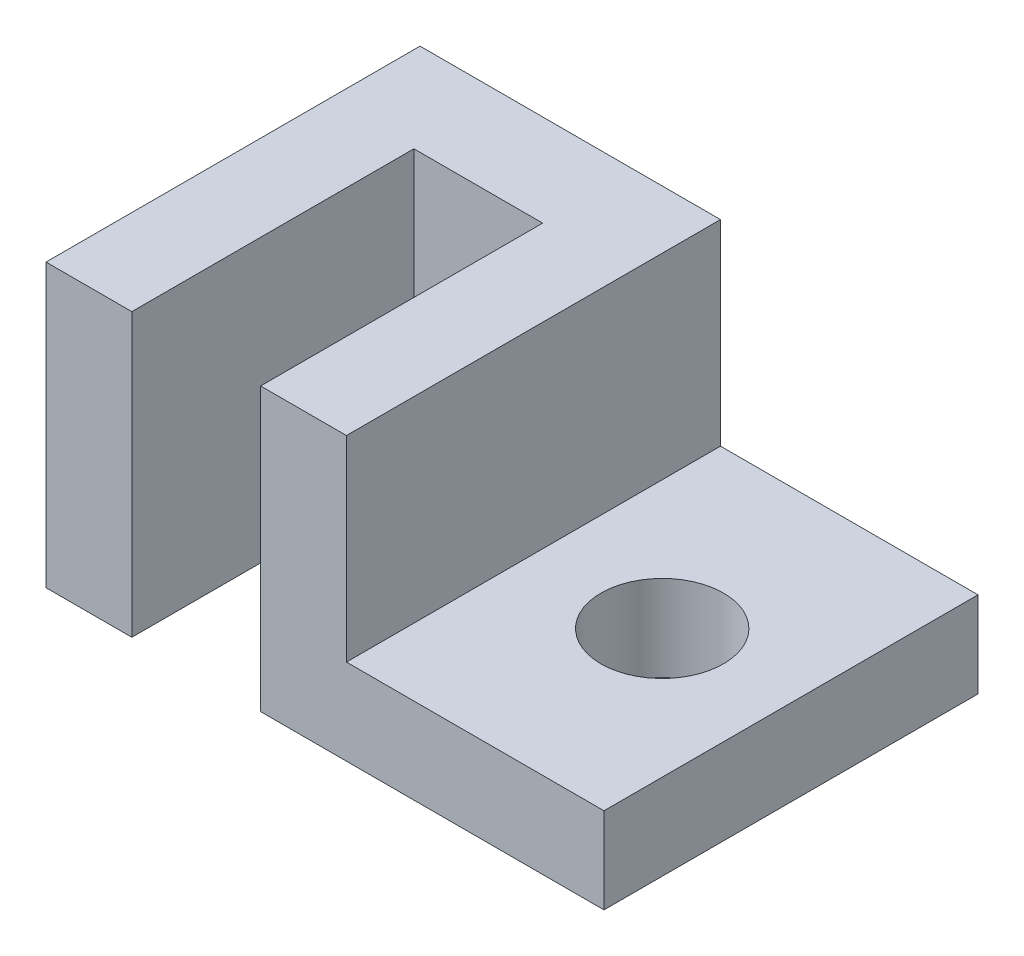
ISO-10303-21;
HEADER;
FILE_DESCRIPTION(('STEP AP214'),'2;1');
FILE_NAME('part.step','',(''),(''),'','','');
FILE_SCHEMA(('AUTOMOTIVE_DESIGN { 1 0 10303 214 1 1 1 1 }'));
ENDSEC;
DATA;
#1=APPLICATION_CONTEXT('core data for automotive mechanical design processes');
#2=APPLICATION_PROTOCOL_DEFINITION('international standard','automotive_design',2000,#1);
#3=PRODUCT_CONTEXT('',#1,'mechanical');
#4=PRODUCT('Part','Part','',(#3));
#5=PRODUCT_RELATED_PRODUCT_CATEGORY('part','',(#4));
#6=PRODUCT_DEFINITION_FORMATION('','',#4);
#7=PRODUCT_DEFINITION_CONTEXT('part definition',#1,'design');
#8=PRODUCT_DEFINITION('design','',#6,#7);
#9=PRODUCT_DEFINITION_SHAPE('','',#8);
#10=(LENGTH_UNIT() NAMED_UNIT(*) SI_UNIT(.MILLI.,.METRE.));
#11=(NAMED_UNIT(*) PLANE_ANGLE_UNIT() SI_UNIT($,.RADIAN.));
#12=(NAMED_UNIT(*) SI_UNIT($,.STERADIAN.) SOLID_ANGLE_UNIT());
#13=UNCERTAINTY_MEASURE_WITH_UNIT(LENGTH_MEASURE(1.E-05),#10,'distance_accuracy_value','');
#14=(GEOMETRIC_REPRESENTATION_CONTEXT(3) GLOBAL_UNCERTAINTY_ASSIGNED_CONTEXT((#13)) GLOBAL_UNIT_ASSIGNED_CONTEXT((#10,
#11,#12)) REPRESENTATION_CONTEXT('',''));
#15=CARTESIAN_POINT('',(0.,0.,0.));
#16=DIRECTION('',(0.,0.,1.));
#17=DIRECTION('',(1.,0.,0.));
#18=AXIS2_PLACEMENT_3D('',#15,#16,#17);
#19=CARTESIAN_POINT('',(49.,46.,-61.));
#20=DIRECTION('',(-1.,0.,0.));
#21=DIRECTION('',(0.,0.,1.));
#22=AXIS2_PLACEMENT_3D('',#19,#20,#21);
#23=PLANE('',#22);
#24=DIRECTION('',(0.,0.,1.));
#25=VECTOR('',#24,1.);
#26=CARTESIAN_POINT('',(49.,14.,-61.));
#27=LINE('',#26,#25);
#28=CARTESIAN_POINT('',(49.,14.,-61.));
#29=VERTEX_POINT('',#28);
#30=CARTESIAN_POINT('',(49.,14.,0.));
#31=VERTEX_POINT('',#30);
#32=EDGE_CURVE('E48',#29,#31,#27,.T.);
#33=ORIENTED_EDGE('',*,*,#32,.F.);
#34=DIRECTION('',(0.,-1.,0.));
#35=VECTOR('',#34,1.);
#36=CARTESIAN_POINT('',(49.,46.,-61.));
#37=LINE('',#36,#35);
#38=CARTESIAN_POINT('',(49.,46.,-61.));
#39=VERTEX_POINT('',#38);
#40=EDGE_CURVE('E117',#39,#29,#37,.T.);
#41=ORIENTED_EDGE('',*,*,#40,.F.);
#42=DIRECTION('',(0.,0.,-1.));
#43=VECTOR('',#42,1.);
#44=CARTESIAN_POINT('',(49.,46.,-61.));
#45=LINE('',#44,#43);
#46=CARTESIAN_POINT('',(49.,46.,0.));
#47=VERTEX_POINT('',#46);
#48=EDGE_CURVE('E108',#47,#39,#45,.T.);
#49=ORIENTED_EDGE('',*,*,#48,.F.);
#50=DIRECTION('',(0.,-1.,0.));
#51=VECTOR('',#50,1.);
#52=CARTESIAN_POINT('',(49.,46.,0.));
#53=LINE('',#52,#51);
#54=EDGE_CURVE('E121',#47,#31,#53,.T.);
#55=ORIENTED_EDGE('',*,*,#54,.T.);
#56=EDGE_LOOP('',(#33,#41,#49,#55));
#57=FACE_BOUND('',#56,.T.);
#58=ADVANCED_FACE('F33',(#57),#23,.F.);
#59=CARTESIAN_POINT('',(14.,46.,0.));
#60=DIRECTION('',(0.,0.,-1.));
#61=DIRECTION('',(-1.,0.,0.));
#62=AXIS2_PLACEMENT_3D('',#59,#60,#61);
#63=PLANE('',#62);
#64=DIRECTION('',(1.,0.,0.));
#65=VECTOR('',#64,1.);
#66=CARTESIAN_POINT('',(14.,0.,0.));
#67=LINE('',#66,#65);
#68=CARTESIAN_POINT('',(0.,0.,0.));
#69=VERTEX_POINT('',#68);
#70=CARTESIAN_POINT('',(14.,0.,0.));
#71=VERTEX_POINT('',#70);
#72=EDGE_CURVE('E130',#69,#71,#67,.T.);
#73=ORIENTED_EDGE('',*,*,#72,.T.);
#74=DIRECTION('',(0.,-1.,0.));
#75=VECTOR('',#74,1.);
#76=CARTESIAN_POINT('',(14.,46.,0.));
#77=LINE('',#76,#75);
#78=CARTESIAN_POINT('',(14.,46.,0.));
#79=VERTEX_POINT('',#78);
#80=EDGE_CURVE('E11',#79,#71,#77,.T.);
#81=ORIENTED_EDGE('',*,*,#80,.F.);
#82=DIRECTION('',(1.,0.,0.));
#83=VECTOR('',#82,1.);
#84=CARTESIAN_POINT('',(14.,46.,0.));
#85=LINE('',#84,#83);
#86=CARTESIAN_POINT('',(0.,46.,0.));
#87=VERTEX_POINT('',#86);
#88=EDGE_CURVE('E146',#87,#79,#85,.T.);
#89=ORIENTED_EDGE('',*,*,#88,.F.);
#90=DIRECTION('',(0.,-1.,0.));
#91=VECTOR('',#90,1.);
#92=CARTESIAN_POINT('',(0.,46.,0.));
#93=LINE('',#92,#91);
#94=EDGE_CURVE('E126',#87,#69,#93,.T.);
#95=ORIENTED_EDGE('',*,*,#94,.T.);
#96=EDGE_LOOP('',(#73,#81,#89,#95));
#97=FACE_BOUND('',#96,.T.);
#98=ADVANCED_FACE('F35',(#97),#63,.F.);
#99=CARTESIAN_POINT('',(14.,46.,-46.));
#100=DIRECTION('',(-1.,0.,0.));
#101=DIRECTION('',(0.,0.,1.));
#102=AXIS2_PLACEMENT_3D('',#99,#100,#101);
#103=PLANE('',#102);
#104=DIRECTION('',(0.,0.,-1.));
#105=VECTOR('',#104,1.);
#106=CARTESIAN_POINT('',(14.,0.,-46.));
#107=LINE('',#106,#105);
#108=CARTESIAN_POINT('',(14.,0.,-46.));
#109=VERTEX_POINT('',#108);
#110=EDGE_CURVE('E133',#71,#109,#107,.T.);
#111=ORIENTED_EDGE('',*,*,#110,.T.);
#112=DIRECTION('',(0.,-1.,0.));
#113=VECTOR('',#112,1.);
#114=CARTESIAN_POINT('',(14.,46.,-46.));
#115=LINE('',#114,#113);
#116=CARTESIAN_POINT('',(14.,46.,-46.));
#117=VERTEX_POINT('',#116);
#118=EDGE_CURVE('E41',#117,#109,#115,.T.);
#119=ORIENTED_EDGE('',*,*,#118,.F.);
#120=DIRECTION('',(0.,0.,-1.));
#121=VECTOR('',#120,1.);
#122=CARTESIAN_POINT('',(14.,46.,-46.));
#123=LINE('',#122,#121);
#124=EDGE_CURVE('E92',#79,#117,#123,.T.);
#125=ORIENTED_EDGE('',*,*,#124,.F.);
#126=ORIENTED_EDGE('',*,*,#80,.T.);
#127=EDGE_LOOP('',(#111,#119,#125,#126));
#128=FACE_BOUND('',#127,.T.);
#129=ADVANCED_FACE('F229',(#128),#103,.F.);
#130=CARTESIAN_POINT('',(35.,46.,-46.));
#131=DIRECTION('',(0.,0.,-1.));
#132=DIRECTION('',(-1.,0.,0.));
#133=AXIS2_PLACEMENT_3D('',#130,#131,#132);
#134=PLANE('',#133);
#135=DIRECTION('',(1.,0.,0.));
#136=VECTOR('',#135,1.);
#137=CARTESIAN_POINT('',(35.,0.,-46.));
#138=LINE('',#137,#136);
#139=CARTESIAN_POINT('',(35.,0.,-46.));
#140=VERTEX_POINT('',#139);
#141=EDGE_CURVE('E136',#109,#140,#138,.T.);
#142=ORIENTED_EDGE('',*,*,#141,.T.);
#143=DIRECTION('',(0.,-1.,0.));
#144=VECTOR('',#143,1.);
#145=CARTESIAN_POINT('',(35.,46.,-46.));
#146=LINE('',#145,#144);
#147=CARTESIAN_POINT('',(35.,46.,-46.));
#148=VERTEX_POINT('',#147);
#149=EDGE_CURVE('E153',#148,#140,#146,.T.);
#150=ORIENTED_EDGE('',*,*,#149,.F.);
#151=DIRECTION('',(1.,0.,0.));
#152=VECTOR('',#151,1.);
#153=CARTESIAN_POINT('',(35.,46.,-46.));
#154=LINE('',#153,#152);
#155=EDGE_CURVE('E161',#117,#148,#154,.T.);
#156=ORIENTED_EDGE('',*,*,#155,.F.);
#157=ORIENTED_EDGE('',*,*,#118,.T.);
#158=EDGE_LOOP('',(#142,#150,#156,#157));
#159=FACE_BOUND('',#158,.T.);
#160=ADVANCED_FACE('F159',(#159),#134,.F.);
#161=CARTESIAN_POINT('',(35.,46.,0.));
#162=DIRECTION('',(1.,0.,0.));
#163=DIRECTION('',(0.,0.,-1.));
#164=AXIS2_PLACEMENT_3D('',#161,#162,#163);
#165=PLANE('',#164);
#166=DIRECTION('',(0.,0.,1.));
#167=VECTOR('',#166,1.);
#168=CARTESIAN_POINT('',(35.,0.,0.));
#169=LINE('',#168,#167);
#170=CARTESIAN_POINT('',(35.,0.,0.));
#171=VERTEX_POINT('',#170);
#172=EDGE_CURVE('E138',#140,#171,#169,.T.);
#173=ORIENTED_EDGE('',*,*,#172,.T.);
#174=DIRECTION('',(0.,-1.,0.));
#175=VECTOR('',#174,1.);
#176=CARTESIAN_POINT('',(35.,46.,0.));
#177=LINE('',#176,#175);
#178=CARTESIAN_POINT('',(35.,46.,0.));
#179=VERTEX_POINT('',#178);
#180=EDGE_CURVE('E150',#179,#171,#177,.T.);
#181=ORIENTED_EDGE('',*,*,#180,.F.);
#182=DIRECTION('',(0.,0.,1.));
#183=VECTOR('',#182,1.);
#184=CARTESIAN_POINT('',(35.,46.,0.));
#185=LINE('',#184,#183);
#186=EDGE_CURVE('E179',#148,#179,#185,.T.);
#187=ORIENTED_EDGE('',*,*,#186,.F.);
#188=ORIENTED_EDGE('',*,*,#149,.T.);
#189=EDGE_LOOP('',(#173,#181,#187,#188));
#190=FACE_BOUND('',#189,.T.);
#191=ADVANCED_FACE('F171',(#190),#165,.F.);
#192=CARTESIAN_POINT('',(49.,46.,0.));
#193=DIRECTION('',(0.,0.,-1.));
#194=DIRECTION('',(-1.,0.,0.));
#195=AXIS2_PLACEMENT_3D('',#192,#193,#194);
#196=PLANE('',#195);
#197=DIRECTION('',(1.,0.,0.));
#198=VECTOR('',#197,1.);
#199=CARTESIAN_POINT('',(49.,0.,0.));
#200=LINE('',#199,#198);
#201=CARTESIAN_POINT('',(91.,0.,0.));
#202=VERTEX_POINT('',#201);
#203=EDGE_CURVE('E140',#171,#202,#200,.T.);
#204=ORIENTED_EDGE('',*,*,#203,.T.);
#205=DIRECTION('',(0.,-1.,0.));
#206=VECTOR('',#205,1.);
#207=CARTESIAN_POINT('',(91.,14.,0.));
#208=LINE('',#207,#206);
#209=CARTESIAN_POINT('',(91.,14.,0.));
#210=VERTEX_POINT('',#209);
#211=EDGE_CURVE('E134',#210,#202,#208,.T.);
#212=ORIENTED_EDGE('',*,*,#211,.F.);
#213=DIRECTION('',(1.,0.,0.));
#214=VECTOR('',#213,1.);
#215=CARTESIAN_POINT('',(49.,14.,0.));
#216=LINE('',#215,#214);
#217=EDGE_CURVE('E198',#31,#210,#216,.T.);
#218=ORIENTED_EDGE('',*,*,#217,.F.);
#219=ORIENTED_EDGE('',*,*,#54,.F.);
#220=DIRECTION('',(1.,0.,0.));
#221=VECTOR('',#220,1.);
#222=CARTESIAN_POINT('',(49.,46.,0.));
#223=LINE('',#222,#221);
#224=EDGE_CURVE('E114',#179,#47,#223,.T.);
#225=ORIENTED_EDGE('',*,*,#224,.F.);
#226=ORIENTED_EDGE('',*,*,#180,.T.);
#227=EDGE_LOOP('',(#204,#212,#218,#219,#225,#226));
#228=FACE_BOUND('',#227,.T.);
#229=ADVANCED_FACE('F174',(#228),#196,.F.);
#230=CARTESIAN_POINT('',(0.,46.,-61.));
#231=DIRECTION('',(0.,0.,1.));
#232=DIRECTION('',(1.,0.,0.));
#233=AXIS2_PLACEMENT_3D('',#230,#231,#232);
#234=PLANE('',#233);
#235=DIRECTION('',(-1.,0.,0.));
#236=VECTOR('',#235,1.);
#237=CARTESIAN_POINT('',(0.,0.,-61.));
#238=LINE('',#237,#236);
#239=CARTESIAN_POINT('',(91.,0.,-61.));
#240=VERTEX_POINT('',#239);
#241=CARTESIAN_POINT('',(0.,0.,-61.));
#242=VERTEX_POINT('',#241);
#243=EDGE_CURVE('E143',#240,#242,#238,.T.);
#244=ORIENTED_EDGE('',*,*,#243,.T.);
#245=DIRECTION('',(0.,-1.,0.));
#246=VECTOR('',#245,1.);
#247=CARTESIAN_POINT('',(0.,46.,-61.));
#248=LINE('',#247,#246);
#249=CARTESIAN_POINT('',(0.,46.,-61.));
#250=VERTEX_POINT('',#249);
#251=EDGE_CURVE('E122',#250,#242,#248,.T.);
#252=ORIENTED_EDGE('',*,*,#251,.F.);
#253=DIRECTION('',(-1.,0.,0.));
#254=VECTOR('',#253,1.);
#255=CARTESIAN_POINT('',(0.,46.,-61.));
#256=LINE('',#255,#254);
#257=EDGE_CURVE('E111',#39,#250,#256,.T.);
#258=ORIENTED_EDGE('',*,*,#257,.F.);
#259=ORIENTED_EDGE('',*,*,#40,.T.);
#260=DIRECTION('',(-1.,0.,0.));
#261=VECTOR('',#260,1.);
#262=CARTESIAN_POINT('',(49.,14.,-61.));
#263=LINE('',#262,#261);
#264=CARTESIAN_POINT('',(91.,14.,-61.));
#265=VERTEX_POINT('',#264);
#266=EDGE_CURVE('E189',#265,#29,#263,.T.);
#267=ORIENTED_EDGE('',*,*,#266,.F.);
#268=DIRECTION('',(0.,-1.,0.));
#269=VECTOR('',#268,1.);
#270=CARTESIAN_POINT('',(91.,14.,-61.));
#271=LINE('',#270,#269);
#272=EDGE_CURVE('E186',#265,#240,#271,.T.);
#273=ORIENTED_EDGE('',*,*,#272,.T.);
#274=EDGE_LOOP('',(#244,#252,#258,#259,#267,#273));
#275=FACE_BOUND('',#274,.T.);
#276=ADVANCED_FACE('F124',(#275),#234,.F.);
#277=CARTESIAN_POINT('',(0.,46.,0.));
#278=DIRECTION('',(1.,0.,0.));
#279=DIRECTION('',(0.,0.,-1.));
#280=AXIS2_PLACEMENT_3D('',#277,#278,#279);
#281=PLANE('',#280);
#282=DIRECTION('',(0.,0.,1.));
#283=VECTOR('',#282,1.);
#284=CARTESIAN_POINT('',(0.,0.,0.));
#285=LINE('',#284,#283);
#286=EDGE_CURVE('E84',#242,#69,#285,.T.);
#287=ORIENTED_EDGE('',*,*,#286,.T.);
#288=ORIENTED_EDGE('',*,*,#94,.F.);
#289=DIRECTION('',(0.,0.,1.));
#290=VECTOR('',#289,1.);
#291=CARTESIAN_POINT('',(0.,46.,0.));
#292=LINE('',#291,#290);
#293=EDGE_CURVE('E57',#250,#87,#292,.T.);
#294=ORIENTED_EDGE('',*,*,#293,.F.);
#295=ORIENTED_EDGE('',*,*,#251,.T.);
#296=EDGE_LOOP('',(#287,#288,#294,#295));
#297=FACE_BOUND('',#296,.T.);
#298=ADVANCED_FACE('F252',(#297),#281,.F.);
#299=CARTESIAN_POINT('',(0.,46.,0.));
#300=DIRECTION('',(0.,-1.,0.));
#301=DIRECTION('',(0.,0.,-1.));
#302=AXIS2_PLACEMENT_3D('',#299,#300,#301);
#303=PLANE('',#302);
#304=ORIENTED_EDGE('',*,*,#88,.T.);
#305=ORIENTED_EDGE('',*,*,#124,.T.);
#306=ORIENTED_EDGE('',*,*,#155,.T.);
#307=ORIENTED_EDGE('',*,*,#186,.T.);
#308=ORIENTED_EDGE('',*,*,#224,.T.);
#309=ORIENTED_EDGE('',*,*,#48,.T.);
#310=ORIENTED_EDGE('',*,*,#257,.T.);
#311=ORIENTED_EDGE('',*,*,#293,.T.);
#312=EDGE_LOOP('',(#304,#305,#306,#307,#308,#309,#310,#311));
#313=FACE_BOUND('',#312,.T.);
#314=ADVANCED_FACE('F109',(#313),#303,.F.);
#315=CARTESIAN_POINT('',(0.,0.,0.));
#316=DIRECTION('',(0.,-1.,0.));
#317=DIRECTION('',(0.,0.,-1.));
#318=AXIS2_PLACEMENT_3D('',#315,#316,#317);
#319=PLANE('',#318);
#320=ORIENTED_EDGE('',*,*,#72,.F.);
#321=ORIENTED_EDGE('',*,*,#286,.F.);
#322=ORIENTED_EDGE('',*,*,#243,.F.);
#323=DIRECTION('',(0.,0.,-1.));
#324=VECTOR('',#323,1.);
#325=CARTESIAN_POINT('',(91.,0.,-61.));
#326=LINE('',#325,#324);
#327=EDGE_CURVE('E190',#202,#240,#326,.T.);
#328=ORIENTED_EDGE('',*,*,#327,.F.);
#329=ORIENTED_EDGE('',*,*,#203,.F.);
#330=ORIENTED_EDGE('',*,*,#172,.F.);
#331=ORIENTED_EDGE('',*,*,#141,.F.);
#332=ORIENTED_EDGE('',*,*,#110,.F.);
#333=EDGE_LOOP('',(#320,#321,#322,#328,#329,#330,#331,#332));
#334=FACE_BOUND('',#333,.T.);
#335=CARTESIAN_POINT('',(70.,0.,-30.5));
#336=DIRECTION('',(0.,1.,0.));
#337=DIRECTION('',(0.,0.,1.));
#338=AXIS2_PLACEMENT_3D('',#335,#336,#337);
#339=CIRCLE('',#338,9.99999999999999);
#340=CARTESIAN_POINT('',(70.,0.,-20.5));
#341=VERTEX_POINT('',#340);
#342=EDGE_CURVE('E202',#341,#341,#339,.T.);
#343=ORIENTED_EDGE('',*,*,#342,.T.);
#344=EDGE_LOOP('',(#343));
#345=FACE_BOUND('',#344,.T.);
#346=ADVANCED_FACE('F165',(#334,#345),#319,.T.);
#347=CARTESIAN_POINT('',(0.,14.,0.));
#348=DIRECTION('',(0.,1.,0.));
#349=DIRECTION('',(0.,0.,1.));
#350=AXIS2_PLACEMENT_3D('',#347,#348,#349);
#351=PLANE('',#350);
#352=ORIENTED_EDGE('',*,*,#32,.T.);
#353=ORIENTED_EDGE('',*,*,#217,.T.);
#354=DIRECTION('',(0.,0.,-1.));
#355=VECTOR('',#354,1.);
#356=CARTESIAN_POINT('',(91.,14.,-61.));
#357=LINE('',#356,#355);
#358=EDGE_CURVE('E195',#210,#265,#357,.T.);
#359=ORIENTED_EDGE('',*,*,#358,.T.);
#360=ORIENTED_EDGE('',*,*,#266,.T.);
#361=EDGE_LOOP('',(#352,#353,#359,#360));
#362=FACE_BOUND('',#361,.T.);
#363=CARTESIAN_POINT('',(70.,14.,-30.5));
#364=DIRECTION('',(0.,1.,0.));
#365=DIRECTION('',(0.,0.,1.));
#366=AXIS2_PLACEMENT_3D('',#363,#364,#365);
#367=CIRCLE('',#366,9.99999999999999);
#368=CARTESIAN_POINT('',(70.,14.,-20.5));
#369=VERTEX_POINT('',#368);
#370=EDGE_CURVE('E193',#369,#369,#367,.T.);
#371=ORIENTED_EDGE('',*,*,#370,.F.);
#372=EDGE_LOOP('',(#371));
#373=FACE_BOUND('',#372,.T.);
#374=ADVANCED_FACE('F211',(#362,#373),#351,.T.);
#375=CARTESIAN_POINT('',(91.,14.,-61.));
#376=DIRECTION('',(-1.,0.,0.));
#377=DIRECTION('',(0.,0.,1.));
#378=AXIS2_PLACEMENT_3D('',#375,#376,#377);
#379=PLANE('',#378);
#380=ORIENTED_EDGE('',*,*,#327,.T.);
#381=ORIENTED_EDGE('',*,*,#272,.F.);
#382=ORIENTED_EDGE('',*,*,#358,.F.);
#383=ORIENTED_EDGE('',*,*,#211,.T.);
#384=EDGE_LOOP('',(#380,#381,#382,#383));
#385=FACE_BOUND('',#384,.T.);
#386=ADVANCED_FACE('F213',(#385),#379,.F.);
#387=CARTESIAN_POINT('',(70.,14.,-30.5));
#388=DIRECTION('',(0.,-1.,0.));
#389=DIRECTION('',(0.,0.,-1.));
#390=AXIS2_PLACEMENT_3D('',#387,#388,#389);
#391=CYLINDRICAL_SURFACE('',#390,9.99999999999999);
#392=ORIENTED_EDGE('',*,*,#370,.T.);
#393=EDGE_LOOP('',(#392));
#394=FACE_BOUND('',#393,.T.);
#395=ORIENTED_EDGE('',*,*,#342,.F.);
#396=EDGE_LOOP('',(#395));
#397=FACE_BOUND('',#396,.T.);
#398=ADVANCED_FACE('F208',(#394,#397),#391,.F.);
#399=CLOSED_SHELL('',(#58,#98,#129,#160,#191,#229,#276,#298,#314,#346,#374,#386,#398));
#400=MANIFOLD_SOLID_BREP('B2',#399);
#401=ADVANCED_BREP_SHAPE_REPRESENTATION('',(#18,#400),#14);
#402=SHAPE_DEFINITION_REPRESENTATION(#9,#401);
ENDSEC;
END-ISO-10303-21;
